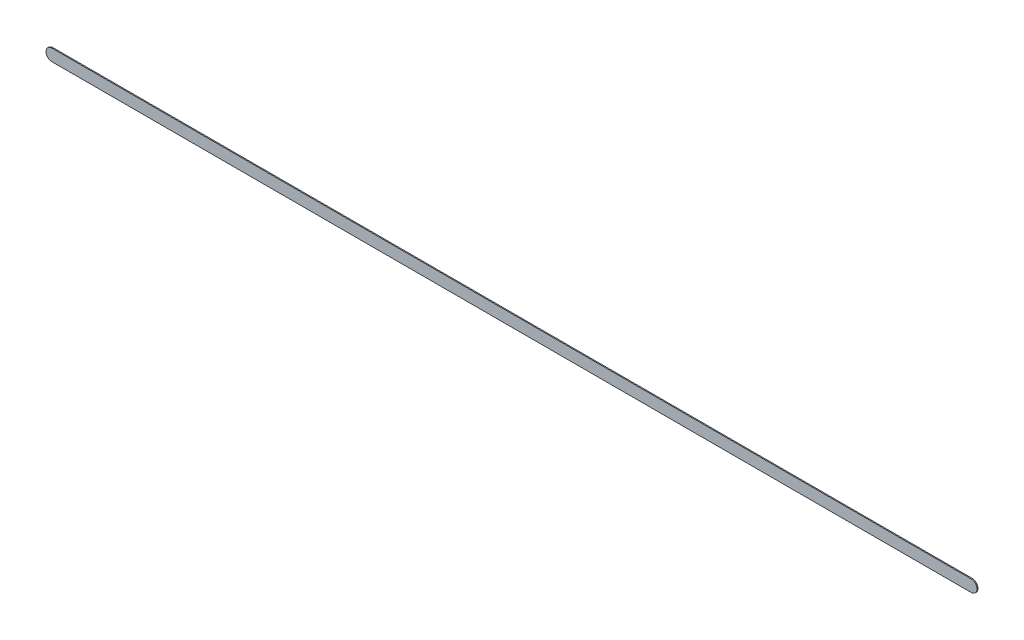
ISO-10303-21;
HEADER;
FILE_DESCRIPTION(('STEP AP214'),'2;1');
FILE_NAME('part.step','',(''),(''),'','','');
FILE_SCHEMA(('AUTOMOTIVE_DESIGN { 1 0 10303 214 1 1 1 1 }'));
ENDSEC;
DATA;
#1=APPLICATION_CONTEXT('core data for automotive mechanical design processes');
#2=APPLICATION_PROTOCOL_DEFINITION('international standard','automotive_design',2000,#1);
#3=PRODUCT_CONTEXT('',#1,'mechanical');
#4=PRODUCT('Part','Part','',(#3));
#5=PRODUCT_RELATED_PRODUCT_CATEGORY('part','',(#4));
#6=PRODUCT_DEFINITION_FORMATION('','',#4);
#7=PRODUCT_DEFINITION_CONTEXT('part definition',#1,'design');
#8=PRODUCT_DEFINITION('design','',#6,#7);
#9=PRODUCT_DEFINITION_SHAPE('','',#8);
#10=(LENGTH_UNIT() NAMED_UNIT(*) SI_UNIT(.MILLI.,.METRE.));
#11=(NAMED_UNIT(*) PLANE_ANGLE_UNIT() SI_UNIT($,.RADIAN.));
#12=(NAMED_UNIT(*) SI_UNIT($,.STERADIAN.) SOLID_ANGLE_UNIT());
#13=UNCERTAINTY_MEASURE_WITH_UNIT(LENGTH_MEASURE(1.E-05),#10,'distance_accuracy_value','');
#14=(GEOMETRIC_REPRESENTATION_CONTEXT(3) GLOBAL_UNCERTAINTY_ASSIGNED_CONTEXT((#13)) GLOBAL_UNIT_ASSIGNED_CONTEXT((#10,
#11,#12)) REPRESENTATION_CONTEXT('',''));
#15=CARTESIAN_POINT('',(0.,0.,0.));
#16=DIRECTION('',(0.,0.,1.));
#17=DIRECTION('',(1.,0.,0.));
#18=AXIS2_PLACEMENT_3D('',#15,#16,#17);
#19=CARTESIAN_POINT('',(47.5375,25.375,1.1723000001));
#20=DIRECTION('',(0.,0.,1.));
#21=DIRECTION('',(1.,0.,0.));
#22=AXIS2_PLACEMENT_3D('',#19,#20,#21);
#23=PLANE('',#22);
#24=CARTESIAN_POINT('',(41.6875,25.375,1.1723000001));
#25=DIRECTION('',(0.,0.,-1.));
#26=DIRECTION('',(1.,0.,0.));
#27=AXIS2_PLACEMENT_3D('',#24,#25,#26);
#28=CIRCLE('',#27,0.075);
#29=CARTESIAN_POINT('',(41.6875,25.3,1.1723000001));
#30=VERTEX_POINT('',#29);
#31=CARTESIAN_POINT('',(41.6875,25.45,1.1723000001));
#32=VERTEX_POINT('',#31);
#33=EDGE_CURVE('E48',#30,#32,#28,.T.);
#34=ORIENTED_EDGE('',*,*,#33,.F.);
#35=DIRECTION('',(1.,0.,0.));
#36=VECTOR('',#35,1.);
#37=CARTESIAN_POINT('',(53.3875,25.3,1.1723000001));
#38=LINE('',#37,#36);
#39=CARTESIAN_POINT('',(53.3875,25.3,1.1723000001));
#40=VERTEX_POINT('',#39);
#41=EDGE_CURVE('E110',#30,#40,#38,.T.);
#42=ORIENTED_EDGE('',*,*,#41,.T.);
#43=CARTESIAN_POINT('',(53.3875,25.375,1.1723000001));
#44=DIRECTION('',(0.,0.,1.));
#45=DIRECTION('',(1.,0.,0.));
#46=AXIS2_PLACEMENT_3D('',#43,#44,#45);
#47=CIRCLE('',#46,0.075);
#48=CARTESIAN_POINT('',(53.4625,25.375,1.1723000001));
#49=VERTEX_POINT('',#48);
#50=EDGE_CURVE('E113',#40,#49,#47,.T.);
#51=ORIENTED_EDGE('',*,*,#50,.T.);
#52=CARTESIAN_POINT('',(53.3875,25.375,1.1723000001));
#53=DIRECTION('',(0.,0.,1.));
#54=DIRECTION('',(1.,0.,0.));
#55=AXIS2_PLACEMENT_3D('',#52,#53,#54);
#56=CIRCLE('',#55,0.075);
#57=CARTESIAN_POINT('',(53.3875,25.45,1.1723000001));
#58=VERTEX_POINT('',#57);
#59=EDGE_CURVE('E86',#49,#58,#56,.T.);
#60=ORIENTED_EDGE('',*,*,#59,.T.);
#61=DIRECTION('',(-1.,0.,0.));
#62=VECTOR('',#61,1.);
#63=CARTESIAN_POINT('',(41.6875,25.45,1.1723000001));
#64=LINE('',#63,#62);
#65=EDGE_CURVE('E11',#58,#32,#64,.T.);
#66=ORIENTED_EDGE('',*,*,#65,.T.);
#67=EDGE_LOOP('',(#34,#42,#51,#60,#66));
#68=FACE_BOUND('',#67,.T.);
#69=ADVANCED_FACE('F17',(#68),#23,.T.);
#70=CARTESIAN_POINT('',(41.6875,25.45,1.1596000001));
#71=DIRECTION('',(0.,-1.,0.));
#72=DIRECTION('',(0.,0.,-1.));
#73=AXIS2_PLACEMENT_3D('',#70,#71,#72);
#74=PLANE('',#73);
#75=DIRECTION('',(0.,0.,1.));
#76=VECTOR('',#75,1.);
#77=CARTESIAN_POINT('',(53.3875,25.45,1.1596000001));
#78=LINE('',#77,#76);
#79=CARTESIAN_POINT('',(53.3875,25.45,1.1596000001));
#80=VERTEX_POINT('',#79);
#81=EDGE_CURVE('E77',#80,#58,#78,.T.);
#82=ORIENTED_EDGE('',*,*,#81,.F.);
#83=DIRECTION('',(-1.,0.,0.));
#84=VECTOR('',#83,1.);
#85=CARTESIAN_POINT('',(47.5375,25.45,1.1596000001));
#86=LINE('',#85,#84);
#87=CARTESIAN_POINT('',(41.6875,25.45,1.1596000001));
#88=VERTEX_POINT('',#87);
#89=EDGE_CURVE('E81',#80,#88,#86,.T.);
#90=ORIENTED_EDGE('',*,*,#89,.T.);
#91=DIRECTION('',(0.,0.,-1.));
#92=VECTOR('',#91,1.);
#93=CARTESIAN_POINT('',(41.6875,25.45,1.1596000001));
#94=LINE('',#93,#92);
#95=EDGE_CURVE('E27',#32,#88,#94,.T.);
#96=ORIENTED_EDGE('',*,*,#95,.F.);
#97=ORIENTED_EDGE('',*,*,#65,.F.);
#98=EDGE_LOOP('',(#82,#90,#96,#97));
#99=FACE_BOUND('',#98,.T.);
#100=ADVANCED_FACE('F79',(#99),#74,.F.);
#101=CARTESIAN_POINT('',(41.6875,25.375,1.1596000001));
#102=DIRECTION('',(0.,0.,1.));
#103=DIRECTION('',(1.,0.,0.));
#104=AXIS2_PLACEMENT_3D('',#101,#102,#103);
#105=CYLINDRICAL_SURFACE('',#104,0.075);
#106=CARTESIAN_POINT('',(41.6875,25.375,1.1596000001));
#107=DIRECTION('',(0.,0.,1.));
#108=DIRECTION('',(1.,0.,0.));
#109=AXIS2_PLACEMENT_3D('',#106,#107,#108);
#110=CIRCLE('',#109,0.075);
#111=CARTESIAN_POINT('',(41.6875,25.3,1.1596000001));
#112=VERTEX_POINT('',#111);
#113=EDGE_CURVE('E101',#88,#112,#110,.T.);
#114=ORIENTED_EDGE('',*,*,#113,.T.);
#115=DIRECTION('',(0.,0.,1.));
#116=VECTOR('',#115,1.);
#117=CARTESIAN_POINT('',(41.6875,25.3,1.1596000001));
#118=LINE('',#117,#116);
#119=EDGE_CURVE('E128',#112,#30,#118,.T.);
#120=ORIENTED_EDGE('',*,*,#119,.T.);
#121=ORIENTED_EDGE('',*,*,#33,.T.);
#122=ORIENTED_EDGE('',*,*,#95,.T.);
#123=EDGE_LOOP('',(#114,#120,#121,#122));
#124=FACE_BOUND('',#123,.T.);
#125=ADVANCED_FACE('F142',(#124),#105,.T.);
#126=CARTESIAN_POINT('',(53.3875,25.3,1.1596000001));
#127=DIRECTION('',(0.,1.,0.));
#128=DIRECTION('',(1.,0.,0.));
#129=AXIS2_PLACEMENT_3D('',#126,#127,#128);
#130=PLANE('',#129);
#131=ORIENTED_EDGE('',*,*,#119,.F.);
#132=DIRECTION('',(1.,0.,0.));
#133=VECTOR('',#132,1.);
#134=CARTESIAN_POINT('',(47.5375,25.3,1.1596000001));
#135=LINE('',#134,#133);
#136=CARTESIAN_POINT('',(53.3875,25.3,1.1596000001));
#137=VERTEX_POINT('',#136);
#138=EDGE_CURVE('E21',#112,#137,#135,.T.);
#139=ORIENTED_EDGE('',*,*,#138,.T.);
#140=DIRECTION('',(0.,0.,-1.));
#141=VECTOR('',#140,1.);
#142=CARTESIAN_POINT('',(53.3875,25.3,1.1596000001));
#143=LINE('',#142,#141);
#144=EDGE_CURVE('E122',#40,#137,#143,.T.);
#145=ORIENTED_EDGE('',*,*,#144,.F.);
#146=ORIENTED_EDGE('',*,*,#41,.F.);
#147=EDGE_LOOP('',(#131,#139,#145,#146));
#148=FACE_BOUND('',#147,.T.);
#149=ADVANCED_FACE('F144',(#148),#130,.F.);
#150=CARTESIAN_POINT('',(53.3875,25.375,1.1596000001));
#151=DIRECTION('',(0.,0.,1.));
#152=DIRECTION('',(1.,0.,0.));
#153=AXIS2_PLACEMENT_3D('',#150,#151,#152);
#154=CYLINDRICAL_SURFACE('',#153,0.075);
#155=DIRECTION('',(0.,0.,1.));
#156=VECTOR('',#155,1.);
#157=CARTESIAN_POINT('',(53.4625,25.375,1.1596000001));
#158=LINE('',#157,#156);
#159=CARTESIAN_POINT('',(53.4625,25.375,1.1596000001));
#160=VERTEX_POINT('',#159);
#161=EDGE_CURVE('E92',#160,#49,#158,.T.);
#162=ORIENTED_EDGE('',*,*,#161,.F.);
#163=CARTESIAN_POINT('',(53.3875,25.375,1.1596000001));
#164=DIRECTION('',(0.,0.,1.));
#165=DIRECTION('',(1.,0.,0.));
#166=AXIS2_PLACEMENT_3D('',#163,#164,#165);
#167=CIRCLE('',#166,0.075);
#168=EDGE_CURVE('E87',#160,#80,#167,.T.);
#169=ORIENTED_EDGE('',*,*,#168,.T.);
#170=ORIENTED_EDGE('',*,*,#81,.T.);
#171=ORIENTED_EDGE('',*,*,#59,.F.);
#172=EDGE_LOOP('',(#162,#169,#170,#171));
#173=FACE_BOUND('',#172,.T.);
#174=ADVANCED_FACE('F90',(#173),#154,.T.);
#175=CARTESIAN_POINT('',(47.5375,25.375,1.1596000001));
#176=DIRECTION('',(0.,0.,1.));
#177=DIRECTION('',(1.,0.,0.));
#178=AXIS2_PLACEMENT_3D('',#175,#176,#177);
#179=PLANE('',#178);
#180=ORIENTED_EDGE('',*,*,#138,.F.);
#181=ORIENTED_EDGE('',*,*,#113,.F.);
#182=ORIENTED_EDGE('',*,*,#89,.F.);
#183=ORIENTED_EDGE('',*,*,#168,.F.);
#184=CARTESIAN_POINT('',(53.3875,25.375,1.1596000001));
#185=DIRECTION('',(0.,0.,1.));
#186=DIRECTION('',(1.,0.,0.));
#187=AXIS2_PLACEMENT_3D('',#184,#185,#186);
#188=CIRCLE('',#187,0.075);
#189=EDGE_CURVE('E114',#137,#160,#188,.T.);
#190=ORIENTED_EDGE('',*,*,#189,.F.);
#191=EDGE_LOOP('',(#180,#181,#182,#183,#190));
#192=FACE_BOUND('',#191,.T.);
#193=ADVANCED_FACE('F99',(#192),#179,.F.);
#194=CARTESIAN_POINT('',(53.3875,25.375,1.1596000001));
#195=DIRECTION('',(0.,0.,1.));
#196=DIRECTION('',(1.,0.,0.));
#197=AXIS2_PLACEMENT_3D('',#194,#195,#196);
#198=CYLINDRICAL_SURFACE('',#197,0.075);
#199=ORIENTED_EDGE('',*,*,#189,.T.);
#200=ORIENTED_EDGE('',*,*,#161,.T.);
#201=ORIENTED_EDGE('',*,*,#50,.F.);
#202=ORIENTED_EDGE('',*,*,#144,.T.);
#203=EDGE_LOOP('',(#199,#200,#201,#202));
#204=FACE_BOUND('',#203,.T.);
#205=ADVANCED_FACE('F19',(#204),#198,.T.);
#206=CLOSED_SHELL('',(#69,#100,#125,#149,#174,#193,#205));
#207=MANIFOLD_SOLID_BREP('B1',#206);
#208=ADVANCED_BREP_SHAPE_REPRESENTATION('',(#18,#207),#14);
#209=SHAPE_DEFINITION_REPRESENTATION(#9,#208);
ENDSEC;
END-ISO-10303-21;
